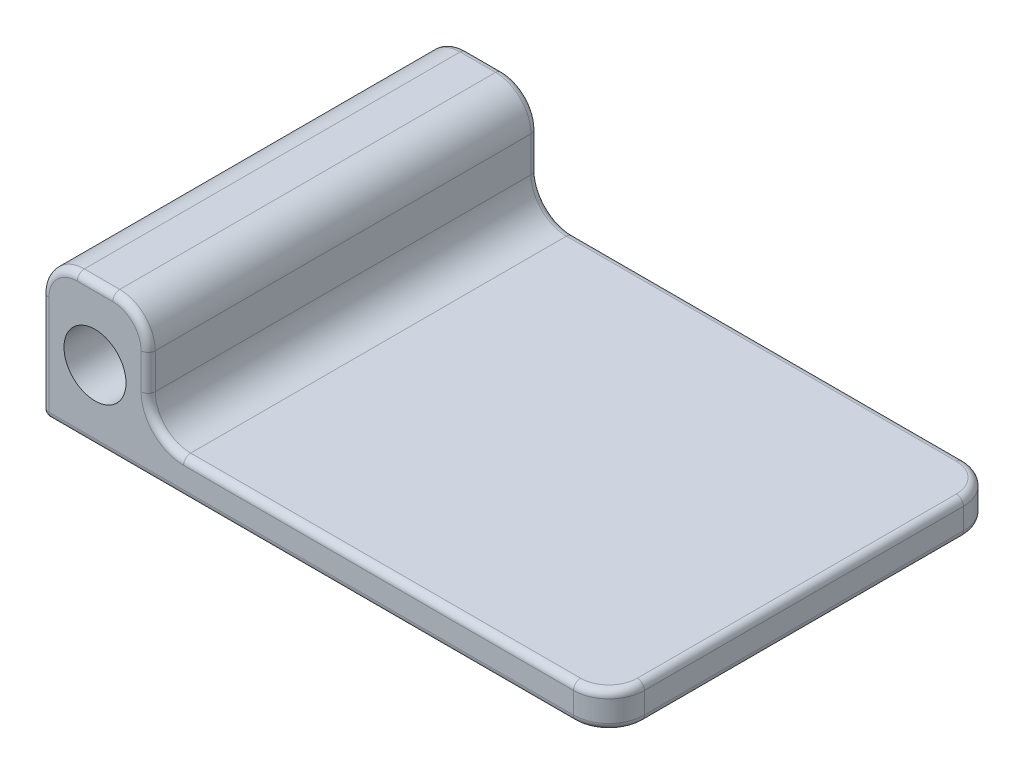
ISO-10303-21;
HEADER;
FILE_DESCRIPTION(('STEP AP214'),'2;1');
FILE_NAME('part.step','',(''),(''),'','','');
FILE_SCHEMA(('AUTOMOTIVE_DESIGN { 1 0 10303 214 1 1 1 1 }'));
ENDSEC;
DATA;
#1=APPLICATION_CONTEXT('core data for automotive mechanical design processes');
#2=APPLICATION_PROTOCOL_DEFINITION('international standard','automotive_design',2000,#1);
#3=PRODUCT_CONTEXT('',#1,'mechanical');
#4=PRODUCT('Part','Part','',(#3));
#5=PRODUCT_RELATED_PRODUCT_CATEGORY('part','',(#4));
#6=PRODUCT_DEFINITION_FORMATION('','',#4);
#7=PRODUCT_DEFINITION_CONTEXT('part definition',#1,'design');
#8=PRODUCT_DEFINITION('design','',#6,#7);
#9=PRODUCT_DEFINITION_SHAPE('','',#8);
#10=(LENGTH_UNIT() NAMED_UNIT(*) SI_UNIT(.MILLI.,.METRE.));
#11=(NAMED_UNIT(*) PLANE_ANGLE_UNIT() SI_UNIT($,.RADIAN.));
#12=(NAMED_UNIT(*) SI_UNIT($,.STERADIAN.) SOLID_ANGLE_UNIT());
#13=UNCERTAINTY_MEASURE_WITH_UNIT(LENGTH_MEASURE(1.E-05),#10,'distance_accuracy_value','');
#14=(GEOMETRIC_REPRESENTATION_CONTEXT(3) GLOBAL_UNCERTAINTY_ASSIGNED_CONTEXT((#13)) GLOBAL_UNIT_ASSIGNED_CONTEXT((#10,
#11,#12)) REPRESENTATION_CONTEXT('',''));
#15=CARTESIAN_POINT('',(0.,0.,0.));
#16=DIRECTION('',(0.,0.,1.));
#17=DIRECTION('',(1.,0.,0.));
#18=AXIS2_PLACEMENT_3D('',#15,#16,#17);
#19=CARTESIAN_POINT('',(101.6,50.8,-69.85));
#20=DIRECTION('',(-1.,0.,0.));
#21=DIRECTION('',(0.,0.,1.));
#22=AXIS2_PLACEMENT_3D('',#19,#20,#21);
#23=PLANE('',#22);
#24=DIRECTION('',(0.,-1.,0.));
#25=VECTOR('',#24,1.);
#26=CARTESIAN_POINT('',(101.6,50.8,57.15));
#27=LINE('',#26,#25);
#28=CARTESIAN_POINT('',(101.6,10.16,57.15));
#29=VERTEX_POINT('',#28);
#30=CARTESIAN_POINT('',(101.6,2.54,57.15));
#31=VERTEX_POINT('',#30);
#32=EDGE_CURVE('E406',#29,#31,#27,.T.);
#33=ORIENTED_EDGE('',*,*,#32,.T.);
#34=DIRECTION('',(0.,0.,-1.));
#35=VECTOR('',#34,1.);
#36=CARTESIAN_POINT('',(101.6,2.54,-69.85));
#37=LINE('',#36,#35);
#38=CARTESIAN_POINT('',(101.6,2.54,-57.15));
#39=VERTEX_POINT('',#38);
#40=EDGE_CURVE('E306',#31,#39,#37,.T.);
#41=ORIENTED_EDGE('',*,*,#40,.T.);
#42=DIRECTION('',(0.,-1.,0.));
#43=VECTOR('',#42,1.);
#44=CARTESIAN_POINT('',(101.6,50.8,-57.15));
#45=LINE('',#44,#43);
#46=CARTESIAN_POINT('',(101.6,10.16,-57.15));
#47=VERTEX_POINT('',#46);
#48=EDGE_CURVE('E223',#39,#47,#45,.F.);
#49=ORIENTED_EDGE('',*,*,#48,.T.);
#50=DIRECTION('',(0.,0.,1.));
#51=VECTOR('',#50,1.);
#52=CARTESIAN_POINT('',(101.6,10.16,-69.85));
#53=LINE('',#52,#51);
#54=EDGE_CURVE('E304',#47,#29,#53,.T.);
#55=ORIENTED_EDGE('',*,*,#54,.T.);
#56=EDGE_LOOP('',(#33,#41,#49,#55));
#57=FACE_BOUND('',#56,.T.);
#58=ADVANCED_FACE('F32',(#57),#23,.F.);
#59=CARTESIAN_POINT('',(-101.6,50.8,-69.85));
#60=DIRECTION('',(0.,0.,1.));
#61=DIRECTION('',(1.,0.,0.));
#62=AXIS2_PLACEMENT_3D('',#59,#60,#61);
#63=PLANE('',#62);
#64=CARTESIAN_POINT('',(-82.55,25.4,-69.85));
#65=DIRECTION('',(0.,0.,1.));
#66=DIRECTION('',(1.,0.,0.));
#67=AXIS2_PLACEMENT_3D('',#64,#65,#66);
#68=CIRCLE('',#67,11.1125);
#69=CARTESIAN_POINT('',(-71.4375,25.4,-69.85));
#70=VERTEX_POINT('',#69);
#71=EDGE_CURVE('E379',#70,#70,#68,.T.);
#72=ORIENTED_EDGE('',*,*,#71,.T.);
#73=EDGE_LOOP('',(#72));
#74=FACE_BOUND('',#73,.T.);
#75=CARTESIAN_POINT('',(-50.8,25.4,-69.85));
#76=DIRECTION('',(0.,0.,1.));
#77=DIRECTION('',(1.,0.,0.));
#78=AXIS2_PLACEMENT_3D('',#75,#76,#77);
#79=CIRCLE('',#78,15.24);
#80=CARTESIAN_POINT('',(-66.04,25.4,-69.85));
#81=VERTEX_POINT('',#80);
#82=CARTESIAN_POINT('',(-50.8,10.16,-69.85));
#83=VERTEX_POINT('',#82);
#84=EDGE_CURVE('E254',#81,#83,#79,.T.);
#85=ORIENTED_EDGE('',*,*,#84,.T.);
#86=DIRECTION('',(1.,0.,0.));
#87=VECTOR('',#86,1.);
#88=CARTESIAN_POINT('',(-101.6,10.16,-69.85));
#89=LINE('',#88,#87);
#90=CARTESIAN_POINT('',(88.9,10.16,-69.85));
#91=VERTEX_POINT('',#90);
#92=EDGE_CURVE('E256',#83,#91,#89,.T.);
#93=ORIENTED_EDGE('',*,*,#92,.T.);
#94=DIRECTION('',(0.,-1.,0.));
#95=VECTOR('',#94,1.);
#96=CARTESIAN_POINT('',(88.9,50.8,-69.85));
#97=LINE('',#96,#95);
#98=CARTESIAN_POINT('',(88.9,2.54,-69.85));
#99=VERTEX_POINT('',#98);
#100=EDGE_CURVE('E403',#91,#99,#97,.T.);
#101=ORIENTED_EDGE('',*,*,#100,.T.);
#102=DIRECTION('',(-1.,0.,0.));
#103=VECTOR('',#102,1.);
#104=CARTESIAN_POINT('',(-101.6,2.54,-69.85));
#105=LINE('',#104,#103);
#106=CARTESIAN_POINT('',(-99.06,2.54,-69.85));
#107=VERTEX_POINT('',#106);
#108=EDGE_CURVE('E244',#99,#107,#105,.T.);
#109=ORIENTED_EDGE('',*,*,#108,.T.);
#110=DIRECTION('',(0.,-1.,0.));
#111=VECTOR('',#110,1.);
#112=CARTESIAN_POINT('',(-99.06,50.8,-69.85));
#113=LINE('',#112,#111);
#114=CARTESIAN_POINT('',(-99.06,38.1,-69.85));
#115=VERTEX_POINT('',#114);
#116=EDGE_CURVE('E242',#107,#115,#113,.F.);
#117=ORIENTED_EDGE('',*,*,#116,.T.);
#118=CARTESIAN_POINT('',(-88.9,38.1,-69.85));
#119=DIRECTION('',(0.,0.,1.));
#120=DIRECTION('',(1.,0.,0.));
#121=AXIS2_PLACEMENT_3D('',#118,#119,#120);
#122=CIRCLE('',#121,10.16);
#123=CARTESIAN_POINT('',(-88.9,48.26,-69.85));
#124=VERTEX_POINT('',#123);
#125=EDGE_CURVE('E246',#115,#124,#122,.F.);
#126=ORIENTED_EDGE('',*,*,#125,.T.);
#127=DIRECTION('',(-1.,0.,0.));
#128=VECTOR('',#127,1.);
#129=CARTESIAN_POINT('',(-76.2,48.26,-69.85));
#130=LINE('',#129,#128);
#131=CARTESIAN_POINT('',(-76.2,48.26,-69.85));
#132=VERTEX_POINT('',#131);
#133=EDGE_CURVE('E248',#124,#132,#130,.F.);
#134=ORIENTED_EDGE('',*,*,#133,.T.);
#135=CARTESIAN_POINT('',(-76.2,38.1,-69.85));
#136=DIRECTION('',(0.,0.,1.));
#137=DIRECTION('',(1.,0.,0.));
#138=AXIS2_PLACEMENT_3D('',#135,#136,#137);
#139=CIRCLE('',#138,10.16);
#140=CARTESIAN_POINT('',(-66.04,38.1,-69.85));
#141=VERTEX_POINT('',#140);
#142=EDGE_CURVE('E250',#132,#141,#139,.F.);
#143=ORIENTED_EDGE('',*,*,#142,.T.);
#144=DIRECTION('',(0.,-1.,0.));
#145=VECTOR('',#144,1.);
#146=CARTESIAN_POINT('',(-66.04,50.8,-69.85));
#147=LINE('',#146,#145);
#148=EDGE_CURVE('E252',#141,#81,#147,.T.);
#149=ORIENTED_EDGE('',*,*,#148,.T.);
#150=EDGE_LOOP('',(#85,#93,#101,#109,#117,#126,#134,#143,#149));
#151=FACE_BOUND('',#150,.T.);
#152=ADVANCED_FACE('F494',(#74,#151),#63,.F.);
#153=CARTESIAN_POINT('',(-101.6,50.8,-69.85));
#154=DIRECTION('',(1.,0.,0.));
#155=DIRECTION('',(0.,0.,-1.));
#156=AXIS2_PLACEMENT_3D('',#153,#154,#155);
#157=PLANE('',#156);
#158=DIRECTION('',(0.,0.,1.));
#159=VECTOR('',#158,1.);
#160=CARTESIAN_POINT('',(-101.6,38.1,-69.85));
#161=LINE('',#160,#159);
#162=CARTESIAN_POINT('',(-101.6,38.1,67.31));
#163=VERTEX_POINT('',#162);
#164=CARTESIAN_POINT('',(-101.6,38.1,-67.31));
#165=VERTEX_POINT('',#164);
#166=EDGE_CURVE('E401',#163,#165,#161,.F.);
#167=ORIENTED_EDGE('',*,*,#166,.T.);
#168=DIRECTION('',(0.,-1.,0.));
#169=VECTOR('',#168,1.);
#170=CARTESIAN_POINT('',(-101.6,50.8,-67.31));
#171=LINE('',#170,#169);
#172=CARTESIAN_POINT('',(-101.6,2.54,-67.31));
#173=VERTEX_POINT('',#172);
#174=EDGE_CURVE('E11',#165,#173,#171,.T.);
#175=ORIENTED_EDGE('',*,*,#174,.T.);
#176=DIRECTION('',(0.,0.,1.));
#177=VECTOR('',#176,1.);
#178=CARTESIAN_POINT('',(-101.6,2.54,-69.85));
#179=LINE('',#178,#177);
#180=CARTESIAN_POINT('',(-101.6,2.54,67.31));
#181=VERTEX_POINT('',#180);
#182=EDGE_CURVE('E48',#173,#181,#179,.T.);
#183=ORIENTED_EDGE('',*,*,#182,.T.);
#184=DIRECTION('',(0.,-1.,0.));
#185=VECTOR('',#184,1.);
#186=CARTESIAN_POINT('',(-101.6,50.8,67.31));
#187=LINE('',#186,#185);
#188=EDGE_CURVE('E41',#181,#163,#187,.F.);
#189=ORIENTED_EDGE('',*,*,#188,.T.);
#190=EDGE_LOOP('',(#167,#175,#183,#189));
#191=FACE_BOUND('',#190,.T.);
#192=ADVANCED_FACE('F442',(#191),#157,.F.);
#193=CARTESIAN_POINT('',(-101.6,50.8,69.85));
#194=DIRECTION('',(0.,0.,-1.));
#195=DIRECTION('',(-1.,0.,0.));
#196=AXIS2_PLACEMENT_3D('',#193,#194,#195);
#197=PLANE('',#196);
#198=DIRECTION('',(0.,-1.,0.));
#199=VECTOR('',#198,1.);
#200=CARTESIAN_POINT('',(88.9,50.8,69.85));
#201=LINE('',#200,#199);
#202=CARTESIAN_POINT('',(88.9,2.54,69.85));
#203=VERTEX_POINT('',#202);
#204=CARTESIAN_POINT('',(88.9,10.16,69.85));
#205=VERTEX_POINT('',#204);
#206=EDGE_CURVE('E220',#203,#205,#201,.F.);
#207=ORIENTED_EDGE('',*,*,#206,.T.);
#208=DIRECTION('',(1.,0.,0.));
#209=VECTOR('',#208,1.);
#210=CARTESIAN_POINT('',(-101.6,10.16,69.85));
#211=LINE('',#210,#209);
#212=CARTESIAN_POINT('',(-50.8,10.16,69.85));
#213=VERTEX_POINT('',#212);
#214=EDGE_CURVE('E302',#205,#213,#211,.F.);
#215=ORIENTED_EDGE('',*,*,#214,.T.);
#216=CARTESIAN_POINT('',(-50.8,25.4,69.85));
#217=DIRECTION('',(0.,0.,-1.));
#218=DIRECTION('',(-1.,0.,0.));
#219=AXIS2_PLACEMENT_3D('',#216,#217,#218);
#220=CIRCLE('',#219,15.24);
#221=CARTESIAN_POINT('',(-66.04,25.4,69.85));
#222=VERTEX_POINT('',#221);
#223=EDGE_CURVE('E300',#213,#222,#220,.T.);
#224=ORIENTED_EDGE('',*,*,#223,.T.);
#225=DIRECTION('',(0.,-1.,0.));
#226=VECTOR('',#225,1.);
#227=CARTESIAN_POINT('',(-66.04,50.8,69.85));
#228=LINE('',#227,#226);
#229=CARTESIAN_POINT('',(-66.04,38.1,69.85));
#230=VERTEX_POINT('',#229);
#231=EDGE_CURVE('E298',#222,#230,#228,.F.);
#232=ORIENTED_EDGE('',*,*,#231,.T.);
#233=CARTESIAN_POINT('',(-76.2,38.1,69.85));
#234=DIRECTION('',(0.,0.,-1.));
#235=DIRECTION('',(-1.,0.,0.));
#236=AXIS2_PLACEMENT_3D('',#233,#234,#235);
#237=CIRCLE('',#236,10.16);
#238=CARTESIAN_POINT('',(-76.2,48.26,69.85));
#239=VERTEX_POINT('',#238);
#240=EDGE_CURVE('E296',#230,#239,#237,.F.);
#241=ORIENTED_EDGE('',*,*,#240,.T.);
#242=DIRECTION('',(1.,0.,0.));
#243=VECTOR('',#242,1.);
#244=CARTESIAN_POINT('',(-88.9,48.26,69.85));
#245=LINE('',#244,#243);
#246=CARTESIAN_POINT('',(-88.9,48.26,69.85));
#247=VERTEX_POINT('',#246);
#248=EDGE_CURVE('E294',#239,#247,#245,.F.);
#249=ORIENTED_EDGE('',*,*,#248,.T.);
#250=CARTESIAN_POINT('',(-88.9,38.1,69.85));
#251=DIRECTION('',(0.,0.,-1.));
#252=DIRECTION('',(-1.,0.,0.));
#253=AXIS2_PLACEMENT_3D('',#250,#251,#252);
#254=CIRCLE('',#253,10.16);
#255=CARTESIAN_POINT('',(-99.06,38.1,69.85));
#256=VERTEX_POINT('',#255);
#257=EDGE_CURVE('E292',#247,#256,#254,.F.);
#258=ORIENTED_EDGE('',*,*,#257,.T.);
#259=DIRECTION('',(0.,-1.,0.));
#260=VECTOR('',#259,1.);
#261=CARTESIAN_POINT('',(-99.06,50.8,69.85));
#262=LINE('',#261,#260);
#263=CARTESIAN_POINT('',(-99.06,2.54,69.85));
#264=VERTEX_POINT('',#263);
#265=EDGE_CURVE('E289',#256,#264,#262,.T.);
#266=ORIENTED_EDGE('',*,*,#265,.T.);
#267=DIRECTION('',(1.,0.,0.));
#268=VECTOR('',#267,1.);
#269=CARTESIAN_POINT('',(-101.6,2.54,69.85));
#270=LINE('',#269,#268);
#271=EDGE_CURVE('E203',#264,#203,#270,.T.);
#272=ORIENTED_EDGE('',*,*,#271,.T.);
#273=EDGE_LOOP('',(#207,#215,#224,#232,#241,#249,#258,#266,#272));
#274=FACE_BOUND('',#273,.T.);
#275=CARTESIAN_POINT('',(-82.55,25.4,69.85));
#276=DIRECTION('',(0.,0.,1.));
#277=DIRECTION('',(1.,0.,0.));
#278=AXIS2_PLACEMENT_3D('',#275,#276,#277);
#279=CIRCLE('',#278,11.1125);
#280=CARTESIAN_POINT('',(-71.4375,25.4,69.85));
#281=VERTEX_POINT('',#280);
#282=EDGE_CURVE('E373',#281,#281,#279,.T.);
#283=ORIENTED_EDGE('',*,*,#282,.F.);
#284=EDGE_LOOP('',(#283));
#285=FACE_BOUND('',#284,.T.);
#286=ADVANCED_FACE('F433',(#274,#285),#197,.F.);
#287=CARTESIAN_POINT('',(101.6,50.8,69.85));
#288=DIRECTION('',(0.,1.,0.));
#289=DIRECTION('',(0.,0.,1.));
#290=AXIS2_PLACEMENT_3D('',#287,#288,#289);
#291=PLANE('',#290);
#292=DIRECTION('',(0.,0.,1.));
#293=VECTOR('',#292,1.);
#294=CARTESIAN_POINT('',(-76.2,50.8,-69.85));
#295=LINE('',#294,#293);
#296=CARTESIAN_POINT('',(-76.2,50.8,67.31));
#297=VERTEX_POINT('',#296);
#298=CARTESIAN_POINT('',(-76.2,50.8,-67.31));
#299=VERTEX_POINT('',#298);
#300=EDGE_CURVE('E395',#297,#299,#295,.F.);
#301=ORIENTED_EDGE('',*,*,#300,.T.);
#302=DIRECTION('',(-1.,0.,0.));
#303=VECTOR('',#302,1.);
#304=CARTESIAN_POINT('',(-88.9,50.8,-67.31));
#305=LINE('',#304,#303);
#306=CARTESIAN_POINT('',(-88.9,50.8,-67.31));
#307=VERTEX_POINT('',#306);
#308=EDGE_CURVE('E265',#299,#307,#305,.T.);
#309=ORIENTED_EDGE('',*,*,#308,.T.);
#310=DIRECTION('',(0.,0.,1.));
#311=VECTOR('',#310,1.);
#312=CARTESIAN_POINT('',(-88.9,50.8,69.85));
#313=LINE('',#312,#311);
#314=CARTESIAN_POINT('',(-88.9,50.8,67.31));
#315=VERTEX_POINT('',#314);
#316=EDGE_CURVE('E398',#307,#315,#313,.T.);
#317=ORIENTED_EDGE('',*,*,#316,.T.);
#318=DIRECTION('',(1.,0.,0.));
#319=VECTOR('',#318,1.);
#320=CARTESIAN_POINT('',(-76.2,50.8,67.31));
#321=LINE('',#320,#319);
#322=EDGE_CURVE('E263',#315,#297,#321,.T.);
#323=ORIENTED_EDGE('',*,*,#322,.T.);
#324=EDGE_LOOP('',(#301,#309,#317,#323));
#325=FACE_BOUND('',#324,.T.);
#326=ADVANCED_FACE('F458',(#325),#291,.T.);
#327=CARTESIAN_POINT('',(101.6,0.,69.85));
#328=DIRECTION('',(0.,1.,0.));
#329=DIRECTION('',(0.,0.,1.));
#330=AXIS2_PLACEMENT_3D('',#327,#328,#329);
#331=PLANE('',#330);
#332=CARTESIAN_POINT('',(88.9,0.,-57.15));
#333=DIRECTION('',(0.,1.,0.));
#334=DIRECTION('',(0.,0.,1.));
#335=AXIS2_PLACEMENT_3D('',#332,#333,#334);
#336=CIRCLE('',#335,10.16);
#337=CARTESIAN_POINT('',(88.9,0.,-67.31));
#338=VERTEX_POINT('',#337);
#339=CARTESIAN_POINT('',(99.06,0.,-57.15));
#340=VERTEX_POINT('',#339);
#341=EDGE_CURVE('E229',#338,#340,#336,.F.);
#342=ORIENTED_EDGE('',*,*,#341,.T.);
#343=DIRECTION('',(0.,0.,-1.));
#344=VECTOR('',#343,1.);
#345=CARTESIAN_POINT('',(99.06,0.,69.85));
#346=LINE('',#345,#344);
#347=CARTESIAN_POINT('',(99.06,0.,57.15));
#348=VERTEX_POINT('',#347);
#349=EDGE_CURVE('E231',#340,#348,#346,.F.);
#350=ORIENTED_EDGE('',*,*,#349,.T.);
#351=CARTESIAN_POINT('',(88.9,0.,57.15));
#352=DIRECTION('',(0.,1.,0.));
#353=DIRECTION('',(0.,0.,1.));
#354=AXIS2_PLACEMENT_3D('',#351,#352,#353);
#355=CIRCLE('',#354,10.16);
#356=CARTESIAN_POINT('',(88.9,0.,67.31));
#357=VERTEX_POINT('',#356);
#358=EDGE_CURVE('E192',#348,#357,#355,.F.);
#359=ORIENTED_EDGE('',*,*,#358,.T.);
#360=DIRECTION('',(1.,0.,0.));
#361=VECTOR('',#360,1.);
#362=CARTESIAN_POINT('',(101.6,0.,67.31));
#363=LINE('',#362,#361);
#364=CARTESIAN_POINT('',(-99.06,0.,67.31));
#365=VERTEX_POINT('',#364);
#366=EDGE_CURVE('E184',#357,#365,#363,.F.);
#367=ORIENTED_EDGE('',*,*,#366,.T.);
#368=DIRECTION('',(0.,0.,1.));
#369=VECTOR('',#368,1.);
#370=CARTESIAN_POINT('',(-99.06,0.,69.85));
#371=LINE('',#370,#369);
#372=CARTESIAN_POINT('',(-99.06,0.,-67.31));
#373=VERTEX_POINT('',#372);
#374=EDGE_CURVE('E189',#365,#373,#371,.F.);
#375=ORIENTED_EDGE('',*,*,#374,.T.);
#376=DIRECTION('',(-1.,0.,0.));
#377=VECTOR('',#376,1.);
#378=CARTESIAN_POINT('',(101.6,0.,-67.31));
#379=LINE('',#378,#377);
#380=EDGE_CURVE('E196',#373,#338,#379,.F.);
#381=ORIENTED_EDGE('',*,*,#380,.T.);
#382=EDGE_LOOP('',(#342,#350,#359,#367,#375,#381));
#383=FACE_BOUND('',#382,.T.);
#384=ADVANCED_FACE('F187',(#383),#331,.F.);
#385=CARTESIAN_POINT('',(101.6,12.7,-69.85));
#386=DIRECTION('',(0.,-1.,0.));
#387=DIRECTION('',(1.,0.,0.));
#388=AXIS2_PLACEMENT_3D('',#385,#386,#387);
#389=PLANE('',#388);
#390=DIRECTION('',(0.,0.,1.));
#391=VECTOR('',#390,1.);
#392=CARTESIAN_POINT('',(-50.8,12.7,69.85));
#393=LINE('',#392,#391);
#394=CARTESIAN_POINT('',(-50.8,12.7,-67.31));
#395=VERTEX_POINT('',#394);
#396=CARTESIAN_POINT('',(-50.8,12.7,67.31));
#397=VERTEX_POINT('',#396);
#398=EDGE_CURVE('E384',#395,#397,#393,.T.);
#399=ORIENTED_EDGE('',*,*,#398,.T.);
#400=DIRECTION('',(1.,0.,0.));
#401=VECTOR('',#400,1.);
#402=CARTESIAN_POINT('',(101.6,12.7,67.31));
#403=LINE('',#402,#401);
#404=CARTESIAN_POINT('',(88.9,12.7,67.31));
#405=VERTEX_POINT('',#404);
#406=EDGE_CURVE('E287',#397,#405,#403,.T.);
#407=ORIENTED_EDGE('',*,*,#406,.T.);
#408=CARTESIAN_POINT('',(88.9,12.7,57.15));
#409=DIRECTION('',(0.,-1.,0.));
#410=DIRECTION('',(1.,0.,0.));
#411=AXIS2_PLACEMENT_3D('',#408,#409,#410);
#412=CIRCLE('',#411,10.16);
#413=CARTESIAN_POINT('',(99.06,12.7,57.15));
#414=VERTEX_POINT('',#413);
#415=EDGE_CURVE('E281',#405,#414,#412,.F.);
#416=ORIENTED_EDGE('',*,*,#415,.T.);
#417=DIRECTION('',(0.,0.,1.));
#418=VECTOR('',#417,1.);
#419=CARTESIAN_POINT('',(99.06,12.7,-69.85));
#420=LINE('',#419,#418);
#421=CARTESIAN_POINT('',(99.06,12.7,-57.15));
#422=VERTEX_POINT('',#421);
#423=EDGE_CURVE('E279',#414,#422,#420,.F.);
#424=ORIENTED_EDGE('',*,*,#423,.T.);
#425=CARTESIAN_POINT('',(88.9,12.7,-57.15));
#426=DIRECTION('',(0.,-1.,0.));
#427=DIRECTION('',(1.,0.,0.));
#428=AXIS2_PLACEMENT_3D('',#425,#426,#427);
#429=CIRCLE('',#428,10.16);
#430=CARTESIAN_POINT('',(88.9,12.7,-67.31));
#431=VERTEX_POINT('',#430);
#432=EDGE_CURVE('E283',#422,#431,#429,.F.);
#433=ORIENTED_EDGE('',*,*,#432,.T.);
#434=DIRECTION('',(1.,0.,0.));
#435=VECTOR('',#434,1.);
#436=CARTESIAN_POINT('',(101.6,12.7,-67.31));
#437=LINE('',#436,#435);
#438=EDGE_CURVE('E285',#431,#395,#437,.F.);
#439=ORIENTED_EDGE('',*,*,#438,.T.);
#440=EDGE_LOOP('',(#399,#407,#416,#424,#433,#439));
#441=FACE_BOUND('',#440,.T.);
#442=ADVANCED_FACE('F424',(#441),#389,.F.);
#443=CARTESIAN_POINT('',(-63.5,50.8,-69.85));
#444=DIRECTION('',(-1.,0.,0.));
#445=DIRECTION('',(0.,0.,1.));
#446=AXIS2_PLACEMENT_3D('',#443,#444,#445);
#447=PLANE('',#446);
#448=DIRECTION('',(0.,0.,1.));
#449=VECTOR('',#448,1.);
#450=CARTESIAN_POINT('',(-63.5,25.4,-69.85));
#451=LINE('',#450,#449);
#452=CARTESIAN_POINT('',(-63.5,25.4,67.31));
#453=VERTEX_POINT('',#452);
#454=CARTESIAN_POINT('',(-63.5,25.4,-67.31));
#455=VERTEX_POINT('',#454);
#456=EDGE_CURVE('E392',#453,#455,#451,.F.);
#457=ORIENTED_EDGE('',*,*,#456,.T.);
#458=DIRECTION('',(0.,-1.,0.));
#459=VECTOR('',#458,1.);
#460=CARTESIAN_POINT('',(-63.5,50.8,-67.31));
#461=LINE('',#460,#459);
#462=CARTESIAN_POINT('',(-63.5,38.1,-67.31));
#463=VERTEX_POINT('',#462);
#464=EDGE_CURVE('E273',#455,#463,#461,.F.);
#465=ORIENTED_EDGE('',*,*,#464,.T.);
#466=DIRECTION('',(0.,0.,1.));
#467=VECTOR('',#466,1.);
#468=CARTESIAN_POINT('',(-63.5,38.1,69.85));
#469=LINE('',#468,#467);
#470=CARTESIAN_POINT('',(-63.5,38.1,67.31));
#471=VERTEX_POINT('',#470);
#472=EDGE_CURVE('E389',#463,#471,#469,.T.);
#473=ORIENTED_EDGE('',*,*,#472,.T.);
#474=DIRECTION('',(0.,-1.,0.));
#475=VECTOR('',#474,1.);
#476=CARTESIAN_POINT('',(-63.5,50.8,67.31));
#477=LINE('',#476,#475);
#478=EDGE_CURVE('E271',#471,#453,#477,.T.);
#479=ORIENTED_EDGE('',*,*,#478,.T.);
#480=EDGE_LOOP('',(#457,#465,#473,#479));
#481=FACE_BOUND('',#480,.T.);
#482=ADVANCED_FACE('F476',(#481),#447,.F.);
#483=CARTESIAN_POINT('',(-82.55,25.4,-69.85));
#484=DIRECTION('',(0.,0.,1.));
#485=DIRECTION('',(1.,0.,0.));
#486=AXIS2_PLACEMENT_3D('',#483,#484,#485);
#487=CYLINDRICAL_SURFACE('',#486,11.1125);
#488=ORIENTED_EDGE('',*,*,#71,.F.);
#489=EDGE_LOOP('',(#488));
#490=FACE_BOUND('',#489,.T.);
#491=ORIENTED_EDGE('',*,*,#282,.T.);
#492=EDGE_LOOP('',(#491));
#493=FACE_BOUND('',#492,.T.);
#494=ADVANCED_FACE('F505',(#490,#493),#487,.F.);
#495=CARTESIAN_POINT('',(-50.8,25.4,-69.85));
#496=DIRECTION('',(0.,0.,-1.));
#497=DIRECTION('',(-1.,0.,0.));
#498=AXIS2_PLACEMENT_3D('',#495,#496,#497);
#499=CYLINDRICAL_SURFACE('',#498,12.7);
#500=ORIENTED_EDGE('',*,*,#398,.F.);
#501=CARTESIAN_POINT('',(-50.8,25.4,-67.31));
#502=DIRECTION('',(0.,0.,1.));
#503=DIRECTION('',(1.,0.,0.));
#504=AXIS2_PLACEMENT_3D('',#501,#502,#503);
#505=CIRCLE('',#504,12.7);
#506=EDGE_CURVE('E277',#395,#455,#505,.F.);
#507=ORIENTED_EDGE('',*,*,#506,.T.);
#508=ORIENTED_EDGE('',*,*,#456,.F.);
#509=CARTESIAN_POINT('',(-50.8,25.4,67.31));
#510=DIRECTION('',(0.,0.,-1.));
#511=DIRECTION('',(-1.,0.,0.));
#512=AXIS2_PLACEMENT_3D('',#509,#510,#511);
#513=CIRCLE('',#512,12.7);
#514=EDGE_CURVE('E275',#453,#397,#513,.F.);
#515=ORIENTED_EDGE('',*,*,#514,.T.);
#516=EDGE_LOOP('',(#500,#507,#508,#515));
#517=FACE_BOUND('',#516,.T.);
#518=ADVANCED_FACE('F480',(#517),#499,.F.);
#519=CARTESIAN_POINT('',(-88.9,38.1,69.85));
#520=DIRECTION('',(0.,0.,-1.));
#521=DIRECTION('',(-1.,0.,0.));
#522=AXIS2_PLACEMENT_3D('',#519,#520,#521);
#523=CYLINDRICAL_SURFACE('',#522,12.7);
#524=ORIENTED_EDGE('',*,*,#316,.F.);
#525=CARTESIAN_POINT('',(-88.9,38.1,-67.31));
#526=DIRECTION('',(0.,0.,1.));
#527=DIRECTION('',(1.,0.,0.));
#528=AXIS2_PLACEMENT_3D('',#525,#526,#527);
#529=CIRCLE('',#528,12.7);
#530=EDGE_CURVE('E260',#307,#165,#529,.T.);
#531=ORIENTED_EDGE('',*,*,#530,.T.);
#532=ORIENTED_EDGE('',*,*,#166,.F.);
#533=CARTESIAN_POINT('',(-88.9,38.1,67.31));
#534=DIRECTION('',(0.,0.,-1.));
#535=DIRECTION('',(-1.,0.,0.));
#536=AXIS2_PLACEMENT_3D('',#533,#534,#535);
#537=CIRCLE('',#536,12.7);
#538=EDGE_CURVE('E258',#163,#315,#537,.T.);
#539=ORIENTED_EDGE('',*,*,#538,.T.);
#540=EDGE_LOOP('',(#524,#531,#532,#539));
#541=FACE_BOUND('',#540,.T.);
#542=ADVANCED_FACE('F446',(#541),#523,.T.);
#543=CARTESIAN_POINT('',(-76.2,38.1,-69.85));
#544=DIRECTION('',(0.,0.,-1.));
#545=DIRECTION('',(-1.,0.,0.));
#546=AXIS2_PLACEMENT_3D('',#543,#544,#545);
#547=CYLINDRICAL_SURFACE('',#546,12.7);
#548=ORIENTED_EDGE('',*,*,#472,.F.);
#549=CARTESIAN_POINT('',(-76.2,38.1,-67.31));
#550=DIRECTION('',(0.,0.,1.));
#551=DIRECTION('',(1.,0.,0.));
#552=AXIS2_PLACEMENT_3D('',#549,#550,#551);
#553=CIRCLE('',#552,12.7);
#554=EDGE_CURVE('E269',#463,#299,#553,.T.);
#555=ORIENTED_EDGE('',*,*,#554,.T.);
#556=ORIENTED_EDGE('',*,*,#300,.F.);
#557=CARTESIAN_POINT('',(-76.2,38.1,67.31));
#558=DIRECTION('',(0.,0.,-1.));
#559=DIRECTION('',(-1.,0.,0.));
#560=AXIS2_PLACEMENT_3D('',#557,#558,#559);
#561=CIRCLE('',#560,12.7);
#562=EDGE_CURVE('E267',#297,#471,#561,.T.);
#563=ORIENTED_EDGE('',*,*,#562,.T.);
#564=EDGE_LOOP('',(#548,#555,#556,#563));
#565=FACE_BOUND('',#564,.T.);
#566=ADVANCED_FACE('F463',(#565),#547,.T.);
#567=CARTESIAN_POINT('',(88.9,50.8,-57.15));
#568=DIRECTION('',(0.,-1.,0.));
#569=DIRECTION('',(0.,0.,-1.));
#570=AXIS2_PLACEMENT_3D('',#567,#568,#569);
#571=CYLINDRICAL_SURFACE('',#570,12.7);
#572=ORIENTED_EDGE('',*,*,#48,.F.);
#573=CARTESIAN_POINT('',(88.9,2.54,-57.15));
#574=DIRECTION('',(0.,1.,0.));
#575=DIRECTION('',(0.,0.,1.));
#576=AXIS2_PLACEMENT_3D('',#573,#574,#575);
#577=CIRCLE('',#576,12.7);
#578=EDGE_CURVE('E235',#39,#99,#577,.T.);
#579=ORIENTED_EDGE('',*,*,#578,.T.);
#580=ORIENTED_EDGE('',*,*,#100,.F.);
#581=CARTESIAN_POINT('',(88.9,10.16,-57.15));
#582=DIRECTION('',(0.,-1.,0.));
#583=DIRECTION('',(1.,0.,0.));
#584=AXIS2_PLACEMENT_3D('',#581,#582,#583);
#585=CIRCLE('',#584,12.7);
#586=EDGE_CURVE('E233',#91,#47,#585,.T.);
#587=ORIENTED_EDGE('',*,*,#586,.T.);
#588=EDGE_LOOP('',(#572,#579,#580,#587));
#589=FACE_BOUND('',#588,.T.);
#590=ADVANCED_FACE('F510',(#589),#571,.T.);
#591=CARTESIAN_POINT('',(88.9,50.8,57.15));
#592=DIRECTION('',(0.,-1.,0.));
#593=DIRECTION('',(0.,0.,-1.));
#594=AXIS2_PLACEMENT_3D('',#591,#592,#593);
#595=CYLINDRICAL_SURFACE('',#594,12.7);
#596=ORIENTED_EDGE('',*,*,#206,.F.);
#597=CARTESIAN_POINT('',(88.9,2.54,57.15));
#598=DIRECTION('',(0.,1.,0.));
#599=DIRECTION('',(0.,0.,1.));
#600=AXIS2_PLACEMENT_3D('',#597,#598,#599);
#601=CIRCLE('',#600,12.7);
#602=EDGE_CURVE('E240',#203,#31,#601,.T.);
#603=ORIENTED_EDGE('',*,*,#602,.T.);
#604=ORIENTED_EDGE('',*,*,#32,.F.);
#605=CARTESIAN_POINT('',(88.9,10.16,57.15));
#606=DIRECTION('',(0.,-1.,0.));
#607=DIRECTION('',(1.,0.,0.));
#608=AXIS2_PLACEMENT_3D('',#605,#606,#607);
#609=CIRCLE('',#608,12.7);
#610=EDGE_CURVE('E238',#29,#205,#609,.T.);
#611=ORIENTED_EDGE('',*,*,#610,.T.);
#612=EDGE_LOOP('',(#596,#603,#604,#611));
#613=FACE_BOUND('',#612,.T.);
#614=ADVANCED_FACE('F431',(#613),#595,.T.);
#615=CARTESIAN_POINT('',(88.9,10.16,57.15));
#616=DIRECTION('',(0.,-1.,0.));
#617=DIRECTION('',(1.,0.,0.));
#618=AXIS2_PLACEMENT_3D('',#615,#616,#617);
#619=TOROIDAL_SURFACE('',#618,10.16,2.54);
#620=CARTESIAN_POINT('',(88.9,10.16,67.31));
#621=DIRECTION('',(-1.,0.,0.));
#622=DIRECTION('',(0.,0.,1.));
#623=AXIS2_PLACEMENT_3D('',#620,#621,#622);
#624=CIRCLE('',#623,2.54);
#625=EDGE_CURVE('E366',#205,#405,#624,.T.);
#626=ORIENTED_EDGE('',*,*,#625,.F.);
#627=ORIENTED_EDGE('',*,*,#610,.F.);
#628=CARTESIAN_POINT('',(99.06,10.16,57.15));
#629=DIRECTION('',(0.,0.,-1.));
#630=DIRECTION('',(-1.,0.,0.));
#631=AXIS2_PLACEMENT_3D('',#628,#629,#630);
#632=CIRCLE('',#631,2.54);
#633=EDGE_CURVE('E36',#414,#29,#632,.T.);
#634=ORIENTED_EDGE('',*,*,#633,.F.);
#635=ORIENTED_EDGE('',*,*,#415,.F.);
#636=EDGE_LOOP('',(#626,#627,#634,#635));
#637=FACE_BOUND('',#636,.T.);
#638=ADVANCED_FACE('F34',(#637),#619,.T.);
#639=CARTESIAN_POINT('',(99.06,10.16,-69.85));
#640=DIRECTION('',(0.,0.,1.));
#641=DIRECTION('',(1.,0.,0.));
#642=AXIS2_PLACEMENT_3D('',#639,#640,#641);
#643=CYLINDRICAL_SURFACE('',#642,2.54);
#644=ORIENTED_EDGE('',*,*,#633,.T.);
#645=ORIENTED_EDGE('',*,*,#54,.F.);
#646=CARTESIAN_POINT('',(99.06,10.16,-57.15));
#647=DIRECTION('',(0.,0.,-1.));
#648=DIRECTION('',(-1.,0.,0.));
#649=AXIS2_PLACEMENT_3D('',#646,#647,#648);
#650=CIRCLE('',#649,2.54);
#651=EDGE_CURVE('E364',#422,#47,#650,.T.);
#652=ORIENTED_EDGE('',*,*,#651,.F.);
#653=ORIENTED_EDGE('',*,*,#423,.F.);
#654=EDGE_LOOP('',(#644,#645,#652,#653));
#655=FACE_BOUND('',#654,.T.);
#656=ADVANCED_FACE('F416',(#655),#643,.T.);
#657=CARTESIAN_POINT('',(101.6,10.16,67.31));
#658=DIRECTION('',(1.,0.,0.));
#659=DIRECTION('',(0.,1.,0.));
#660=AXIS2_PLACEMENT_3D('',#657,#658,#659);
#661=CYLINDRICAL_SURFACE('',#660,2.54);
#662=ORIENTED_EDGE('',*,*,#625,.T.);
#663=ORIENTED_EDGE('',*,*,#406,.F.);
#664=CARTESIAN_POINT('',(-50.8,10.16,67.31));
#665=DIRECTION('',(-1.,0.,0.));
#666=DIRECTION('',(0.,0.,1.));
#667=AXIS2_PLACEMENT_3D('',#664,#665,#666);
#668=CIRCLE('',#667,2.54);
#669=EDGE_CURVE('E361',#213,#397,#668,.T.);
#670=ORIENTED_EDGE('',*,*,#669,.F.);
#671=ORIENTED_EDGE('',*,*,#214,.F.);
#672=EDGE_LOOP('',(#662,#663,#670,#671));
#673=FACE_BOUND('',#672,.T.);
#674=ADVANCED_FACE('F485',(#673),#661,.T.);
#675=CARTESIAN_POINT('',(88.9,10.16,-57.15));
#676=DIRECTION('',(0.,-1.,0.));
#677=DIRECTION('',(1.,0.,0.));
#678=AXIS2_PLACEMENT_3D('',#675,#676,#677);
#679=TOROIDAL_SURFACE('',#678,10.16,2.54);
#680=ORIENTED_EDGE('',*,*,#651,.T.);
#681=ORIENTED_EDGE('',*,*,#586,.F.);
#682=CARTESIAN_POINT('',(88.9,10.16,-67.31));
#683=DIRECTION('',(-1.,0.,0.));
#684=DIRECTION('',(0.,0.,1.));
#685=AXIS2_PLACEMENT_3D('',#682,#683,#684);
#686=CIRCLE('',#685,2.54);
#687=EDGE_CURVE('E358',#431,#91,#686,.T.);
#688=ORIENTED_EDGE('',*,*,#687,.F.);
#689=ORIENTED_EDGE('',*,*,#432,.F.);
#690=EDGE_LOOP('',(#680,#681,#688,#689));
#691=FACE_BOUND('',#690,.T.);
#692=ADVANCED_FACE('F420',(#691),#679,.T.);
#693=CARTESIAN_POINT('',(-50.8,25.4,67.31));
#694=DIRECTION('',(0.,0.,-1.));
#695=DIRECTION('',(-1.,0.,0.));
#696=AXIS2_PLACEMENT_3D('',#693,#694,#695);
#697=TOROIDAL_SURFACE('',#696,15.24,2.54);
#698=ORIENTED_EDGE('',*,*,#669,.T.);
#699=ORIENTED_EDGE('',*,*,#514,.F.);
#700=CARTESIAN_POINT('',(-66.04,25.4,67.31));
#701=DIRECTION('',(0.,1.,0.));
#702=DIRECTION('',(0.,0.,1.));
#703=AXIS2_PLACEMENT_3D('',#700,#701,#702);
#704=CIRCLE('',#703,2.54);
#705=EDGE_CURVE('E355',#222,#453,#704,.T.);
#706=ORIENTED_EDGE('',*,*,#705,.F.);
#707=ORIENTED_EDGE('',*,*,#223,.F.);
#708=EDGE_LOOP('',(#698,#699,#706,#707));
#709=FACE_BOUND('',#708,.T.);
#710=ADVANCED_FACE('F483',(#709),#697,.T.);
#711=CARTESIAN_POINT('',(-101.6,10.16,-67.31));
#712=DIRECTION('',(1.,0.,0.));
#713=DIRECTION('',(0.,1.,0.));
#714=AXIS2_PLACEMENT_3D('',#711,#712,#713);
#715=CYLINDRICAL_SURFACE('',#714,2.54);
#716=ORIENTED_EDGE('',*,*,#687,.T.);
#717=ORIENTED_EDGE('',*,*,#92,.F.);
#718=CARTESIAN_POINT('',(-50.8,10.16,-67.31));
#719=DIRECTION('',(-1.,0.,0.));
#720=DIRECTION('',(0.,0.,1.));
#721=AXIS2_PLACEMENT_3D('',#718,#719,#720);
#722=CIRCLE('',#721,2.54);
#723=EDGE_CURVE('E352',#395,#83,#722,.T.);
#724=ORIENTED_EDGE('',*,*,#723,.F.);
#725=ORIENTED_EDGE('',*,*,#438,.F.);
#726=EDGE_LOOP('',(#716,#717,#724,#725));
#727=FACE_BOUND('',#726,.T.);
#728=ADVANCED_FACE('F575',(#727),#715,.T.);
#729=CARTESIAN_POINT('',(-66.04,50.8,67.31));
#730=DIRECTION('',(0.,-1.,0.));
#731=DIRECTION('',(0.,0.,-1.));
#732=AXIS2_PLACEMENT_3D('',#729,#730,#731);
#733=CYLINDRICAL_SURFACE('',#732,2.54);
#734=ORIENTED_EDGE('',*,*,#705,.T.);
#735=ORIENTED_EDGE('',*,*,#478,.F.);
#736=CARTESIAN_POINT('',(-66.04,38.1,67.31));
#737=DIRECTION('',(0.,1.,0.));
#738=DIRECTION('',(0.,0.,1.));
#739=AXIS2_PLACEMENT_3D('',#736,#737,#738);
#740=CIRCLE('',#739,2.54);
#741=EDGE_CURVE('E349',#230,#471,#740,.T.);
#742=ORIENTED_EDGE('',*,*,#741,.F.);
#743=ORIENTED_EDGE('',*,*,#231,.F.);
#744=EDGE_LOOP('',(#734,#735,#742,#743));
#745=FACE_BOUND('',#744,.T.);
#746=ADVANCED_FACE('F472',(#745),#733,.T.);
#747=CARTESIAN_POINT('',(-50.8,25.4,-67.31));
#748=DIRECTION('',(0.,0.,1.));
#749=DIRECTION('',(1.,0.,0.));
#750=AXIS2_PLACEMENT_3D('',#747,#748,#749);
#751=TOROIDAL_SURFACE('',#750,15.24,2.54);
#752=ORIENTED_EDGE('',*,*,#723,.T.);
#753=ORIENTED_EDGE('',*,*,#84,.F.);
#754=CARTESIAN_POINT('',(-66.04,25.4,-67.31));
#755=DIRECTION('',(0.,1.,0.));
#756=DIRECTION('',(0.,0.,1.));
#757=AXIS2_PLACEMENT_3D('',#754,#755,#756);
#758=CIRCLE('',#757,2.54);
#759=EDGE_CURVE('E346',#455,#81,#758,.T.);
#760=ORIENTED_EDGE('',*,*,#759,.F.);
#761=ORIENTED_EDGE('',*,*,#506,.F.);
#762=EDGE_LOOP('',(#752,#753,#760,#761));
#763=FACE_BOUND('',#762,.T.);
#764=ADVANCED_FACE('F569',(#763),#751,.T.);
#765=CARTESIAN_POINT('',(-76.2,38.1,67.31));
#766=DIRECTION('',(0.,0.,-1.));
#767=DIRECTION('',(-1.,0.,0.));
#768=AXIS2_PLACEMENT_3D('',#765,#766,#767);
#769=TOROIDAL_SURFACE('',#768,10.16,2.54);
#770=ORIENTED_EDGE('',*,*,#741,.T.);
#771=ORIENTED_EDGE('',*,*,#562,.F.);
#772=CARTESIAN_POINT('',(-76.2,48.26,67.31));
#773=DIRECTION('',(-1.,0.,0.));
#774=DIRECTION('',(0.,0.,1.));
#775=AXIS2_PLACEMENT_3D('',#772,#773,#774);
#776=CIRCLE('',#775,2.54);
#777=EDGE_CURVE('E343',#239,#297,#776,.T.);
#778=ORIENTED_EDGE('',*,*,#777,.F.);
#779=ORIENTED_EDGE('',*,*,#240,.F.);
#780=EDGE_LOOP('',(#770,#771,#778,#779));
#781=FACE_BOUND('',#780,.T.);
#782=ADVANCED_FACE('F466',(#781),#769,.T.);
#783=CARTESIAN_POINT('',(-66.04,50.8,-67.31));
#784=DIRECTION('',(0.,-1.,0.));
#785=DIRECTION('',(0.,0.,-1.));
#786=AXIS2_PLACEMENT_3D('',#783,#784,#785);
#787=CYLINDRICAL_SURFACE('',#786,2.54);
#788=ORIENTED_EDGE('',*,*,#759,.T.);
#789=ORIENTED_EDGE('',*,*,#148,.F.);
#790=CARTESIAN_POINT('',(-66.04,38.1,-67.31));
#791=DIRECTION('',(0.,1.,0.));
#792=DIRECTION('',(0.,0.,1.));
#793=AXIS2_PLACEMENT_3D('',#790,#791,#792);
#794=CIRCLE('',#793,2.54);
#795=EDGE_CURVE('E340',#463,#141,#794,.T.);
#796=ORIENTED_EDGE('',*,*,#795,.F.);
#797=ORIENTED_EDGE('',*,*,#464,.F.);
#798=EDGE_LOOP('',(#788,#789,#796,#797));
#799=FACE_BOUND('',#798,.T.);
#800=ADVANCED_FACE('F563',(#799),#787,.T.);
#801=CARTESIAN_POINT('',(101.6,48.26,67.31));
#802=DIRECTION('',(-1.,0.,0.));
#803=DIRECTION('',(0.,0.,1.));
#804=AXIS2_PLACEMENT_3D('',#801,#802,#803);
#805=CYLINDRICAL_SURFACE('',#804,2.54);
#806=ORIENTED_EDGE('',*,*,#777,.T.);
#807=ORIENTED_EDGE('',*,*,#322,.F.);
#808=CARTESIAN_POINT('',(-88.9,48.26,67.31));
#809=DIRECTION('',(-1.,0.,0.));
#810=DIRECTION('',(0.,0.,1.));
#811=AXIS2_PLACEMENT_3D('',#808,#809,#810);
#812=CIRCLE('',#811,2.54);
#813=EDGE_CURVE('E337',#247,#315,#812,.T.);
#814=ORIENTED_EDGE('',*,*,#813,.F.);
#815=ORIENTED_EDGE('',*,*,#248,.F.);
#816=EDGE_LOOP('',(#806,#807,#814,#815));
#817=FACE_BOUND('',#816,.T.);
#818=ADVANCED_FACE('F454',(#817),#805,.T.);
#819=CARTESIAN_POINT('',(-76.2,38.1,-67.31));
#820=DIRECTION('',(0.,0.,1.));
#821=DIRECTION('',(1.,0.,0.));
#822=AXIS2_PLACEMENT_3D('',#819,#820,#821);
#823=TOROIDAL_SURFACE('',#822,10.16,2.54);
#824=ORIENTED_EDGE('',*,*,#795,.T.);
#825=ORIENTED_EDGE('',*,*,#142,.F.);
#826=CARTESIAN_POINT('',(-76.2,48.26,-67.31));
#827=DIRECTION('',(-1.,0.,0.));
#828=DIRECTION('',(0.,0.,1.));
#829=AXIS2_PLACEMENT_3D('',#826,#827,#828);
#830=CIRCLE('',#829,2.54);
#831=EDGE_CURVE('E334',#299,#132,#830,.T.);
#832=ORIENTED_EDGE('',*,*,#831,.F.);
#833=ORIENTED_EDGE('',*,*,#554,.F.);
#834=EDGE_LOOP('',(#824,#825,#832,#833));
#835=FACE_BOUND('',#834,.T.);
#836=ADVANCED_FACE('F557',(#835),#823,.T.);
#837=CARTESIAN_POINT('',(-88.9,38.1,67.31));
#838=DIRECTION('',(0.,0.,-1.));
#839=DIRECTION('',(-1.,0.,0.));
#840=AXIS2_PLACEMENT_3D('',#837,#838,#839);
#841=TOROIDAL_SURFACE('',#840,10.16,2.54);
#842=ORIENTED_EDGE('',*,*,#813,.T.);
#843=ORIENTED_EDGE('',*,*,#538,.F.);
#844=CARTESIAN_POINT('',(-99.06,38.1,67.31));
#845=DIRECTION('',(0.,-1.,0.));
#846=DIRECTION('',(0.,0.,-1.));
#847=AXIS2_PLACEMENT_3D('',#844,#845,#846);
#848=CIRCLE('',#847,2.54);
#849=EDGE_CURVE('E331',#256,#163,#848,.T.);
#850=ORIENTED_EDGE('',*,*,#849,.F.);
#851=ORIENTED_EDGE('',*,*,#257,.F.);
#852=EDGE_LOOP('',(#842,#843,#850,#851));
#853=FACE_BOUND('',#852,.T.);
#854=ADVANCED_FACE('F449',(#853),#841,.T.);
#855=CARTESIAN_POINT('',(101.6,48.26,-67.31));
#856=DIRECTION('',(1.,0.,0.));
#857=DIRECTION('',(0.,0.,-1.));
#858=AXIS2_PLACEMENT_3D('',#855,#856,#857);
#859=CYLINDRICAL_SURFACE('',#858,2.54);
#860=ORIENTED_EDGE('',*,*,#831,.T.);
#861=ORIENTED_EDGE('',*,*,#133,.F.);
#862=CARTESIAN_POINT('',(-88.9,48.26,-67.31));
#863=DIRECTION('',(-1.,0.,0.));
#864=DIRECTION('',(0.,0.,1.));
#865=AXIS2_PLACEMENT_3D('',#862,#863,#864);
#866=CIRCLE('',#865,2.54);
#867=EDGE_CURVE('E328',#307,#124,#866,.T.);
#868=ORIENTED_EDGE('',*,*,#867,.F.);
#869=ORIENTED_EDGE('',*,*,#308,.F.);
#870=EDGE_LOOP('',(#860,#861,#868,#869));
#871=FACE_BOUND('',#870,.T.);
#872=ADVANCED_FACE('F551',(#871),#859,.T.);
#873=CARTESIAN_POINT('',(-99.06,50.8,67.31));
#874=DIRECTION('',(0.,-1.,0.));
#875=DIRECTION('',(0.,0.,-1.));
#876=AXIS2_PLACEMENT_3D('',#873,#874,#875);
#877=CYLINDRICAL_SURFACE('',#876,2.54);
#878=ORIENTED_EDGE('',*,*,#849,.T.);
#879=ORIENTED_EDGE('',*,*,#188,.F.);
#880=CARTESIAN_POINT('',(-99.06,2.54,67.31));
#881=DIRECTION('',(0.,-1.,0.));
#882=DIRECTION('',(0.,0.,-1.));
#883=AXIS2_PLACEMENT_3D('',#880,#881,#882);
#884=CIRCLE('',#883,2.54);
#885=EDGE_CURVE('E212',#264,#181,#884,.T.);
#886=ORIENTED_EDGE('',*,*,#885,.F.);
#887=ORIENTED_EDGE('',*,*,#265,.F.);
#888=EDGE_LOOP('',(#878,#879,#886,#887));
#889=FACE_BOUND('',#888,.T.);
#890=ADVANCED_FACE('F440',(#889),#877,.T.);
#891=CARTESIAN_POINT('',(-88.9,38.1,-67.31));
#892=DIRECTION('',(0.,0.,1.));
#893=DIRECTION('',(1.,0.,0.));
#894=AXIS2_PLACEMENT_3D('',#891,#892,#893);
#895=TOROIDAL_SURFACE('',#894,10.16,2.54);
#896=ORIENTED_EDGE('',*,*,#867,.T.);
#897=ORIENTED_EDGE('',*,*,#125,.F.);
#898=CARTESIAN_POINT('',(-99.06,38.1,-67.31));
#899=DIRECTION('',(0.,-1.,0.));
#900=DIRECTION('',(0.,0.,-1.));
#901=AXIS2_PLACEMENT_3D('',#898,#899,#900);
#902=CIRCLE('',#901,2.54);
#903=EDGE_CURVE('E214',#165,#115,#902,.T.);
#904=ORIENTED_EDGE('',*,*,#903,.F.);
#905=ORIENTED_EDGE('',*,*,#530,.F.);
#906=EDGE_LOOP('',(#896,#897,#904,#905));
#907=FACE_BOUND('',#906,.T.);
#908=ADVANCED_FACE('F545',(#907),#895,.T.);
#909=CARTESIAN_POINT('',(-99.06,2.54,67.31));
#910=DIRECTION('',(0.,0.,1.));
#911=DIRECTION('',(1.,0.,0.));
#912=AXIS2_PLACEMENT_3D('',#909,#910,#911);
#913=SPHERICAL_SURFACE('',#912,2.54);
#914=CARTESIAN_POINT('',(-99.06,2.54,67.31));
#915=DIRECTION('',(-1.,0.,0.));
#916=DIRECTION('',(0.,0.,1.));
#917=AXIS2_PLACEMENT_3D('',#914,#915,#916);
#918=CIRCLE('',#917,2.54);
#919=EDGE_CURVE('E200',#264,#365,#918,.F.);
#920=ORIENTED_EDGE('',*,*,#919,.F.);
#921=ORIENTED_EDGE('',*,*,#885,.T.);
#922=CARTESIAN_POINT('',(-99.06,2.54,67.31));
#923=DIRECTION('',(0.,0.,1.));
#924=DIRECTION('',(1.,0.,0.));
#925=AXIS2_PLACEMENT_3D('',#922,#923,#924);
#926=CIRCLE('',#925,2.54);
#927=EDGE_CURVE('E206',#365,#181,#926,.F.);
#928=ORIENTED_EDGE('',*,*,#927,.F.);
#929=EDGE_LOOP('',(#920,#921,#928));
#930=FACE_BOUND('',#929,.T.);
#931=ADVANCED_FACE('F210',(#930),#913,.T.);
#932=CARTESIAN_POINT('',(-99.06,50.8,-67.31));
#933=DIRECTION('',(0.,-1.,0.));
#934=DIRECTION('',(0.,0.,-1.));
#935=AXIS2_PLACEMENT_3D('',#932,#933,#934);
#936=CYLINDRICAL_SURFACE('',#935,2.54);
#937=ORIENTED_EDGE('',*,*,#903,.T.);
#938=ORIENTED_EDGE('',*,*,#116,.F.);
#939=CARTESIAN_POINT('',(-99.06,2.54,-67.31));
#940=DIRECTION('',(0.,-1.,0.));
#941=DIRECTION('',(0.,0.,-1.));
#942=AXIS2_PLACEMENT_3D('',#939,#940,#941);
#943=CIRCLE('',#942,2.54);
#944=EDGE_CURVE('E207',#173,#107,#943,.T.);
#945=ORIENTED_EDGE('',*,*,#944,.F.);
#946=ORIENTED_EDGE('',*,*,#174,.F.);
#947=EDGE_LOOP('',(#937,#938,#945,#946));
#948=FACE_BOUND('',#947,.T.);
#949=ADVANCED_FACE('F539',(#948),#936,.T.);
#950=CARTESIAN_POINT('',(-99.06,2.54,-69.85));
#951=DIRECTION('',(0.,0.,1.));
#952=DIRECTION('',(1.,0.,0.));
#953=AXIS2_PLACEMENT_3D('',#950,#951,#952);
#954=CYLINDRICAL_SURFACE('',#953,2.54);
#955=ORIENTED_EDGE('',*,*,#927,.T.);
#956=ORIENTED_EDGE('',*,*,#182,.F.);
#957=CARTESIAN_POINT('',(-99.06,2.54,-67.31));
#958=DIRECTION('',(0.,0.,-1.));
#959=DIRECTION('',(-1.,0.,0.));
#960=AXIS2_PLACEMENT_3D('',#957,#958,#959);
#961=CIRCLE('',#960,2.54);
#962=EDGE_CURVE('E218',#373,#173,#961,.T.);
#963=ORIENTED_EDGE('',*,*,#962,.F.);
#964=ORIENTED_EDGE('',*,*,#374,.F.);
#965=EDGE_LOOP('',(#955,#956,#963,#964));
#966=FACE_BOUND('',#965,.T.);
#967=ADVANCED_FACE('F216',(#966),#954,.T.);
#968=CARTESIAN_POINT('',(-101.6,2.54,67.31));
#969=DIRECTION('',(1.,0.,0.));
#970=DIRECTION('',(0.,0.,-1.));
#971=AXIS2_PLACEMENT_3D('',#968,#969,#970);
#972=CYLINDRICAL_SURFACE('',#971,2.54);
#973=ORIENTED_EDGE('',*,*,#919,.T.);
#974=ORIENTED_EDGE('',*,*,#366,.F.);
#975=CARTESIAN_POINT('',(88.9,2.54,67.31));
#976=DIRECTION('',(1.,0.,0.));
#977=DIRECTION('',(0.,0.,-1.));
#978=AXIS2_PLACEMENT_3D('',#975,#976,#977);
#979=CIRCLE('',#978,2.54);
#980=EDGE_CURVE('E320',#203,#357,#979,.T.);
#981=ORIENTED_EDGE('',*,*,#980,.F.);
#982=ORIENTED_EDGE('',*,*,#271,.F.);
#983=EDGE_LOOP('',(#973,#974,#981,#982));
#984=FACE_BOUND('',#983,.T.);
#985=ADVANCED_FACE('F202',(#984),#972,.T.);
#986=CARTESIAN_POINT('',(-99.06,2.54,-67.31));
#987=DIRECTION('',(0.,0.,1.));
#988=DIRECTION('',(1.,0.,0.));
#989=AXIS2_PLACEMENT_3D('',#986,#987,#988);
#990=SPHERICAL_SURFACE('',#989,2.54);
#991=ORIENTED_EDGE('',*,*,#962,.T.);
#992=ORIENTED_EDGE('',*,*,#944,.T.);
#993=CARTESIAN_POINT('',(-99.06,2.54,-67.31));
#994=DIRECTION('',(-1.,0.,0.));
#995=DIRECTION('',(0.,0.,1.));
#996=AXIS2_PLACEMENT_3D('',#993,#994,#995);
#997=CIRCLE('',#996,2.54);
#998=EDGE_CURVE('E317',#373,#107,#997,.F.);
#999=ORIENTED_EDGE('',*,*,#998,.F.);
#1000=EDGE_LOOP('',(#991,#992,#999));
#1001=FACE_BOUND('',#1000,.T.);
#1002=ADVANCED_FACE('F530',(#1001),#990,.T.);
#1003=CARTESIAN_POINT('',(88.9,2.54,57.15));
#1004=DIRECTION('',(0.,1.,0.));
#1005=DIRECTION('',(0.,0.,1.));
#1006=AXIS2_PLACEMENT_3D('',#1003,#1004,#1005);
#1007=TOROIDAL_SURFACE('',#1006,10.16,2.54);
#1008=ORIENTED_EDGE('',*,*,#980,.T.);
#1009=ORIENTED_EDGE('',*,*,#358,.F.);
#1010=CARTESIAN_POINT('',(99.06,2.54,57.15));
#1011=DIRECTION('',(0.,0.,-1.));
#1012=DIRECTION('',(-1.,0.,0.));
#1013=AXIS2_PLACEMENT_3D('',#1010,#1011,#1012);
#1014=CIRCLE('',#1013,2.54);
#1015=EDGE_CURVE('E314',#31,#348,#1014,.T.);
#1016=ORIENTED_EDGE('',*,*,#1015,.F.);
#1017=ORIENTED_EDGE('',*,*,#602,.F.);
#1018=EDGE_LOOP('',(#1008,#1009,#1016,#1017));
#1019=FACE_BOUND('',#1018,.T.);
#1020=ADVANCED_FACE('F526',(#1019),#1007,.T.);
#1021=CARTESIAN_POINT('',(-101.6,2.54,-67.31));
#1022=DIRECTION('',(-1.,0.,0.));
#1023=DIRECTION('',(0.,0.,1.));
#1024=AXIS2_PLACEMENT_3D('',#1021,#1022,#1023);
#1025=CYLINDRICAL_SURFACE('',#1024,2.54);
#1026=ORIENTED_EDGE('',*,*,#998,.T.);
#1027=ORIENTED_EDGE('',*,*,#108,.F.);
#1028=CARTESIAN_POINT('',(88.9,2.54,-67.31));
#1029=DIRECTION('',(1.,0.,0.));
#1030=DIRECTION('',(0.,0.,-1.));
#1031=AXIS2_PLACEMENT_3D('',#1028,#1029,#1030);
#1032=CIRCLE('',#1031,2.54);
#1033=EDGE_CURVE('E312',#338,#99,#1032,.T.);
#1034=ORIENTED_EDGE('',*,*,#1033,.F.);
#1035=ORIENTED_EDGE('',*,*,#380,.F.);
#1036=EDGE_LOOP('',(#1026,#1027,#1034,#1035));
#1037=FACE_BOUND('',#1036,.T.);
#1038=ADVANCED_FACE('F522',(#1037),#1025,.T.);
#1039=CARTESIAN_POINT('',(99.06,2.54,-69.85));
#1040=DIRECTION('',(0.,0.,-1.));
#1041=DIRECTION('',(-1.,0.,0.));
#1042=AXIS2_PLACEMENT_3D('',#1039,#1040,#1041);
#1043=CYLINDRICAL_SURFACE('',#1042,2.54);
#1044=ORIENTED_EDGE('',*,*,#1015,.T.);
#1045=ORIENTED_EDGE('',*,*,#349,.F.);
#1046=CARTESIAN_POINT('',(99.06,2.54,-57.15));
#1047=DIRECTION('',(0.,0.,-1.));
#1048=DIRECTION('',(-1.,0.,0.));
#1049=AXIS2_PLACEMENT_3D('',#1046,#1047,#1048);
#1050=CIRCLE('',#1049,2.54);
#1051=EDGE_CURVE('E310',#39,#340,#1050,.T.);
#1052=ORIENTED_EDGE('',*,*,#1051,.F.);
#1053=ORIENTED_EDGE('',*,*,#40,.F.);
#1054=EDGE_LOOP('',(#1044,#1045,#1052,#1053));
#1055=FACE_BOUND('',#1054,.T.);
#1056=ADVANCED_FACE('F518',(#1055),#1043,.T.);
#1057=CARTESIAN_POINT('',(88.9,2.54,-57.15));
#1058=DIRECTION('',(0.,1.,0.));
#1059=DIRECTION('',(0.,0.,1.));
#1060=AXIS2_PLACEMENT_3D('',#1057,#1058,#1059);
#1061=TOROIDAL_SURFACE('',#1060,10.16,2.54);
#1062=ORIENTED_EDGE('',*,*,#1033,.T.);
#1063=ORIENTED_EDGE('',*,*,#578,.F.);
#1064=ORIENTED_EDGE('',*,*,#1051,.T.);
#1065=ORIENTED_EDGE('',*,*,#341,.F.);
#1066=EDGE_LOOP('',(#1062,#1063,#1064,#1065));
#1067=FACE_BOUND('',#1066,.T.);
#1068=ADVANCED_FACE('F515',(#1067),#1061,.T.);
#1069=CLOSED_SHELL('',(#58,#152,#192,#286,#326,#384,#442,#482,#494,#518,#542,#566,#590,#614,
#638,#656,#674,#692,#710,#728,#746,#764,#782,#800,#818,#836,#854,#872,#890,#908,#931,#949,#967,
#985,#1002,#1020,#1038,#1056,#1068));
#1070=MANIFOLD_SOLID_BREP('B2',#1069);
#1071=ADVANCED_BREP_SHAPE_REPRESENTATION('',(#18,#1070),#14);
#1072=SHAPE_DEFINITION_REPRESENTATION(#9,#1071);
ENDSEC;
END-ISO-10303-21;
